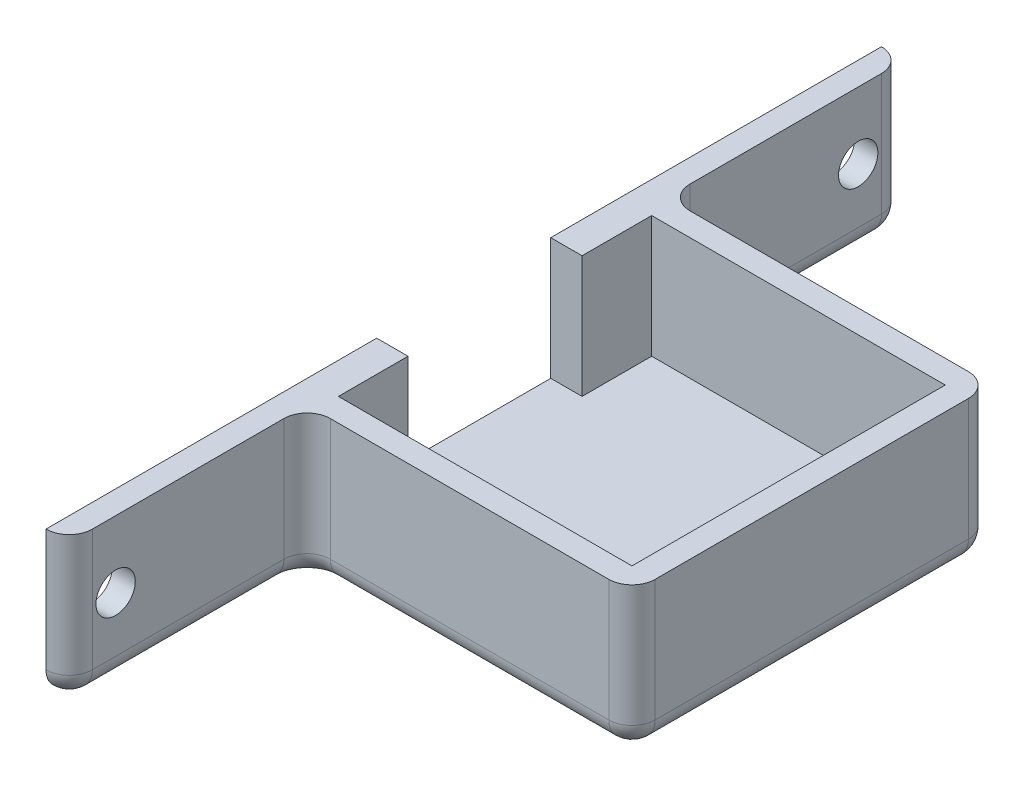
ISO-10303-21;
HEADER;
FILE_DESCRIPTION(('STEP AP214'),'2;1');
FILE_NAME('part.step','',(''),(''),'','','');
FILE_SCHEMA(('AUTOMOTIVE_DESIGN { 1 0 10303 214 1 1 1 1 }'));
ENDSEC;
DATA;
#1=APPLICATION_CONTEXT('core data for automotive mechanical design processes');
#2=APPLICATION_PROTOCOL_DEFINITION('international standard','automotive_design',2000,#1);
#3=PRODUCT_CONTEXT('',#1,'mechanical');
#4=PRODUCT('Part','Part','',(#3));
#5=PRODUCT_RELATED_PRODUCT_CATEGORY('part','',(#4));
#6=PRODUCT_DEFINITION_FORMATION('','',#4);
#7=PRODUCT_DEFINITION_CONTEXT('part definition',#1,'design');
#8=PRODUCT_DEFINITION('design','',#6,#7);
#9=PRODUCT_DEFINITION_SHAPE('','',#8);
#10=(LENGTH_UNIT() NAMED_UNIT(*) SI_UNIT(.MILLI.,.METRE.));
#11=(NAMED_UNIT(*) PLANE_ANGLE_UNIT() SI_UNIT($,.RADIAN.));
#12=(NAMED_UNIT(*) SI_UNIT($,.STERADIAN.) SOLID_ANGLE_UNIT());
#13=UNCERTAINTY_MEASURE_WITH_UNIT(LENGTH_MEASURE(1.E-05),#10,'distance_accuracy_value','');
#14=(GEOMETRIC_REPRESENTATION_CONTEXT(3) GLOBAL_UNCERTAINTY_ASSIGNED_CONTEXT((#13)) GLOBAL_UNIT_ASSIGNED_CONTEXT((#10,
#11,#12)) REPRESENTATION_CONTEXT('',''));
#15=CARTESIAN_POINT('',(0.,0.,0.));
#16=DIRECTION('',(0.,0.,1.));
#17=DIRECTION('',(1.,0.,0.));
#18=AXIS2_PLACEMENT_3D('',#15,#16,#17);
#19=CARTESIAN_POINT('',(0.,2.54,0.));
#20=DIRECTION('',(0.,-1.,0.));
#21=DIRECTION('',(0.,0.,-1.));
#22=AXIS2_PLACEMENT_3D('',#19,#20,#21);
#23=PLANE('',#22);
#24=DIRECTION('',(-1.,0.,0.));
#25=VECTOR('',#24,1.);
#26=CARTESIAN_POINT('',(0.,2.54,-7.62));
#27=LINE('',#26,#25);
#28=CARTESIAN_POINT('',(3.429,2.54,-7.62));
#29=VERTEX_POINT('',#28);
#30=CARTESIAN_POINT('',(0.,2.54,-7.62));
#31=VERTEX_POINT('',#30);
#32=EDGE_CURVE('E412',#29,#31,#27,.T.);
#33=ORIENTED_EDGE('',*,*,#32,.F.);
#34=DIRECTION('',(0.,0.,-1.));
#35=VECTOR('',#34,1.);
#36=CARTESIAN_POINT('',(3.429,2.54,0.));
#37=LINE('',#36,#35);
#38=CARTESIAN_POINT('',(3.429,2.54,0.));
#39=VERTEX_POINT('',#38);
#40=EDGE_CURVE('E410',#39,#29,#37,.T.);
#41=ORIENTED_EDGE('',*,*,#40,.F.);
#42=DIRECTION('',(1.,0.,0.));
#43=VECTOR('',#42,1.);
#44=CARTESIAN_POINT('',(0.,2.54,0.));
#45=LINE('',#44,#43);
#46=CARTESIAN_POINT('',(35.56,2.54,0.));
#47=VERTEX_POINT('',#46);
#48=EDGE_CURVE('E223',#39,#47,#45,.T.);
#49=ORIENTED_EDGE('',*,*,#48,.T.);
#50=DIRECTION('',(0.,0.,-1.));
#51=VECTOR('',#50,1.);
#52=CARTESIAN_POINT('',(35.56,2.54,0.));
#53=LINE('',#52,#51);
#54=CARTESIAN_POINT('',(35.56,2.54,-34.29));
#55=VERTEX_POINT('',#54);
#56=EDGE_CURVE('E259',#47,#55,#53,.T.);
#57=ORIENTED_EDGE('',*,*,#56,.T.);
#58=DIRECTION('',(-1.,0.,0.));
#59=VECTOR('',#58,1.);
#60=CARTESIAN_POINT('',(0.,2.54,-34.29));
#61=LINE('',#60,#59);
#62=CARTESIAN_POINT('',(3.429,2.54,-34.29));
#63=VERTEX_POINT('',#62);
#64=EDGE_CURVE('E261',#55,#63,#61,.T.);
#65=ORIENTED_EDGE('',*,*,#64,.T.);
#66=DIRECTION('',(0.,0.,-1.));
#67=VECTOR('',#66,1.);
#68=CARTESIAN_POINT('',(3.429,2.54,-34.29));
#69=LINE('',#68,#67);
#70=CARTESIAN_POINT('',(3.429,2.54,-26.67));
#71=VERTEX_POINT('',#70);
#72=EDGE_CURVE('E409',#71,#63,#69,.T.);
#73=ORIENTED_EDGE('',*,*,#72,.F.);
#74=DIRECTION('',(1.,0.,0.));
#75=VECTOR('',#74,1.);
#76=CARTESIAN_POINT('',(0.,2.54,-26.67));
#77=LINE('',#76,#75);
#78=CARTESIAN_POINT('',(0.,2.54,-26.67));
#79=VERTEX_POINT('',#78);
#80=EDGE_CURVE('E413',#79,#71,#77,.T.);
#81=ORIENTED_EDGE('',*,*,#80,.F.);
#82=DIRECTION('',(0.,0.,1.));
#83=VECTOR('',#82,1.);
#84=CARTESIAN_POINT('',(0.,2.54,0.));
#85=LINE('',#84,#83);
#86=EDGE_CURVE('E254',#79,#31,#85,.T.);
#87=ORIENTED_EDGE('',*,*,#86,.T.);
#88=EDGE_LOOP('',(#33,#41,#49,#57,#65,#73,#81,#87));
#89=FACE_BOUND('',#88,.T.);
#90=ADVANCED_FACE('F41',(#89),#23,.F.);
#91=CARTESIAN_POINT('',(35.56,15.875,0.));
#92=DIRECTION('',(0.,0.,1.));
#93=DIRECTION('',(1.,0.,0.));
#94=AXIS2_PLACEMENT_3D('',#91,#92,#93);
#95=PLANE('',#94);
#96=DIRECTION('',(0.,-1.,0.));
#97=VECTOR('',#96,1.);
#98=CARTESIAN_POINT('',(3.429,24.2309823479948,0.));
#99=LINE('',#98,#97);
#100=CARTESIAN_POINT('',(3.429,15.875,0.));
#101=VERTEX_POINT('',#100);
#102=EDGE_CURVE('E208',#101,#39,#99,.T.);
#103=ORIENTED_EDGE('',*,*,#102,.F.);
#104=DIRECTION('',(-1.,0.,0.));
#105=VECTOR('',#104,1.);
#106=CARTESIAN_POINT('',(35.56,15.875,0.));
#107=LINE('',#106,#105);
#108=CARTESIAN_POINT('',(35.56,15.875,0.));
#109=VERTEX_POINT('',#108);
#110=EDGE_CURVE('E222',#109,#101,#107,.T.);
#111=ORIENTED_EDGE('',*,*,#110,.F.);
#112=DIRECTION('',(0.,-1.,0.));
#113=VECTOR('',#112,1.);
#114=CARTESIAN_POINT('',(35.56,15.875,0.));
#115=LINE('',#114,#113);
#116=EDGE_CURVE('E248',#109,#47,#115,.T.);
#117=ORIENTED_EDGE('',*,*,#116,.T.);
#118=ORIENTED_EDGE('',*,*,#48,.F.);
#119=EDGE_LOOP('',(#103,#111,#117,#118));
#120=FACE_BOUND('',#119,.T.);
#121=ADVANCED_FACE('F220',(#120),#95,.F.);
#122=CARTESIAN_POINT('',(0.,15.875,-34.29));
#123=DIRECTION('',(0.,0.,-1.));
#124=DIRECTION('',(-1.,0.,0.));
#125=AXIS2_PLACEMENT_3D('',#122,#123,#124);
#126=PLANE('',#125);
#127=DIRECTION('',(0.,-1.,0.));
#128=VECTOR('',#127,1.);
#129=CARTESIAN_POINT('',(3.429,24.2309823479948,-34.29));
#130=LINE('',#129,#128);
#131=CARTESIAN_POINT('',(3.429,15.875,-34.29));
#132=VERTEX_POINT('',#131);
#133=EDGE_CURVE('E58',#132,#63,#130,.T.);
#134=ORIENTED_EDGE('',*,*,#133,.T.);
#135=ORIENTED_EDGE('',*,*,#64,.F.);
#136=DIRECTION('',(0.,-1.,0.));
#137=VECTOR('',#136,1.);
#138=CARTESIAN_POINT('',(35.56,15.875,-34.29));
#139=LINE('',#138,#137);
#140=CARTESIAN_POINT('',(35.56,15.875,-34.29));
#141=VERTEX_POINT('',#140);
#142=EDGE_CURVE('E250',#141,#55,#139,.T.);
#143=ORIENTED_EDGE('',*,*,#142,.F.);
#144=DIRECTION('',(1.,0.,0.));
#145=VECTOR('',#144,1.);
#146=CARTESIAN_POINT('',(0.,15.875,-34.29));
#147=LINE('',#146,#145);
#148=EDGE_CURVE('E234',#132,#141,#147,.T.);
#149=ORIENTED_EDGE('',*,*,#148,.F.);
#150=EDGE_LOOP('',(#134,#135,#143,#149));
#151=FACE_BOUND('',#150,.T.);
#152=ADVANCED_FACE('F404',(#151),#126,.F.);
#153=CARTESIAN_POINT('',(0.,0.,0.));
#154=DIRECTION('',(0.,-1.,0.));
#155=DIRECTION('',(0.,0.,-1.));
#156=AXIS2_PLACEMENT_3D('',#153,#154,#155);
#157=PLANE('',#156);
#158=CARTESIAN_POINT('',(5.08,0.,5.08));
#159=DIRECTION('',(0.,-1.,0.));
#160=DIRECTION('',(0.,0.,-1.));
#161=AXIS2_PLACEMENT_3D('',#158,#159,#160);
#162=CIRCLE('',#161,5.08);
#163=CARTESIAN_POINT('',(0.,0.,5.08));
#164=VERTEX_POINT('',#163);
#165=CARTESIAN_POINT('',(5.08,0.,0.));
#166=VERTEX_POINT('',#165);
#167=EDGE_CURVE('E300',#164,#166,#162,.T.);
#168=ORIENTED_EDGE('',*,*,#167,.F.);
#169=DIRECTION('',(0.,0.,1.));
#170=VECTOR('',#169,1.);
#171=CARTESIAN_POINT('',(0.,0.,0.));
#172=LINE('',#171,#170);
#173=CARTESIAN_POINT('',(0.,0.,-39.37));
#174=VERTEX_POINT('',#173);
#175=EDGE_CURVE('E266',#174,#164,#172,.T.);
#176=ORIENTED_EDGE('',*,*,#175,.F.);
#177=CARTESIAN_POINT('',(5.08,0.,-39.37));
#178=DIRECTION('',(0.,-1.,0.));
#179=DIRECTION('',(0.,0.,-1.));
#180=AXIS2_PLACEMENT_3D('',#177,#178,#179);
#181=CIRCLE('',#180,5.08);
#182=CARTESIAN_POINT('',(5.08,0.,-34.29));
#183=VERTEX_POINT('',#182);
#184=EDGE_CURVE('E297',#183,#174,#181,.T.);
#185=ORIENTED_EDGE('',*,*,#184,.F.);
#186=DIRECTION('',(-1.,0.,0.));
#187=VECTOR('',#186,1.);
#188=CARTESIAN_POINT('',(38.1,0.,-34.29));
#189=LINE('',#188,#187);
#190=CARTESIAN_POINT('',(35.56,0.,-34.29));
#191=VERTEX_POINT('',#190);
#192=EDGE_CURVE('E295',#183,#191,#189,.F.);
#193=ORIENTED_EDGE('',*,*,#192,.T.);
#194=DIRECTION('',(0.,0.,-1.));
#195=VECTOR('',#194,1.);
#196=CARTESIAN_POINT('',(35.56,0.,2.54));
#197=LINE('',#196,#195);
#198=CARTESIAN_POINT('',(35.56,0.,0.));
#199=VERTEX_POINT('',#198);
#200=EDGE_CURVE('E291',#191,#199,#197,.F.);
#201=ORIENTED_EDGE('',*,*,#200,.T.);
#202=DIRECTION('',(1.,0.,0.));
#203=VECTOR('',#202,1.);
#204=CARTESIAN_POINT('',(2.54000000000001,0.,0.));
#205=LINE('',#204,#203);
#206=EDGE_CURVE('E293',#199,#166,#205,.F.);
#207=ORIENTED_EDGE('',*,*,#206,.T.);
#208=EDGE_LOOP('',(#168,#176,#185,#193,#201,#207));
#209=FACE_BOUND('',#208,.T.);
#210=ADVANCED_FACE('F460',(#209),#157,.T.);
#211=CARTESIAN_POINT('',(0.,15.875,-36.83));
#212=DIRECTION('',(0.,0.,1.));
#213=DIRECTION('',(1.,0.,0.));
#214=AXIS2_PLACEMENT_3D('',#211,#212,#213);
#215=PLANE('',#214);
#216=DIRECTION('',(-1.,0.,0.));
#217=VECTOR('',#216,1.);
#218=CARTESIAN_POINT('',(2.54,2.54,-36.83));
#219=LINE('',#218,#217);
#220=CARTESIAN_POINT('',(35.56,2.54,-36.83));
#221=VERTEX_POINT('',#220);
#222=CARTESIAN_POINT('',(5.08,2.54,-36.83));
#223=VERTEX_POINT('',#222);
#224=EDGE_CURVE('E277',#221,#223,#219,.T.);
#225=ORIENTED_EDGE('',*,*,#224,.T.);
#226=DIRECTION('',(0.,-1.,0.));
#227=VECTOR('',#226,1.);
#228=CARTESIAN_POINT('',(5.08,15.875,-36.83));
#229=LINE('',#228,#227);
#230=CARTESIAN_POINT('',(5.08,15.875,-36.83));
#231=VERTEX_POINT('',#230);
#232=EDGE_CURVE('E281',#223,#231,#229,.F.);
#233=ORIENTED_EDGE('',*,*,#232,.T.);
#234=DIRECTION('',(-1.,0.,0.));
#235=VECTOR('',#234,1.);
#236=CARTESIAN_POINT('',(0.,15.875,-36.83));
#237=LINE('',#236,#235);
#238=CARTESIAN_POINT('',(35.56,15.875,-36.83));
#239=VERTEX_POINT('',#238);
#240=EDGE_CURVE('E243',#239,#231,#237,.T.);
#241=ORIENTED_EDGE('',*,*,#240,.F.);
#242=DIRECTION('',(0.,-1.,0.));
#243=VECTOR('',#242,1.);
#244=CARTESIAN_POINT('',(35.56,15.875,-36.83));
#245=LINE('',#244,#243);
#246=EDGE_CURVE('E279',#239,#221,#245,.T.);
#247=ORIENTED_EDGE('',*,*,#246,.T.);
#248=EDGE_LOOP('',(#225,#233,#241,#247));
#249=FACE_BOUND('',#248,.T.);
#250=ADVANCED_FACE('F463',(#249),#215,.F.);
#251=CARTESIAN_POINT('',(38.1,15.875,2.54));
#252=DIRECTION('',(0.,0.,-1.));
#253=DIRECTION('',(-1.,0.,0.));
#254=AXIS2_PLACEMENT_3D('',#251,#252,#253);
#255=PLANE('',#254);
#256=DIRECTION('',(1.,0.,0.));
#257=VECTOR('',#256,1.);
#258=CARTESIAN_POINT('',(38.1,15.875,2.54));
#259=LINE('',#258,#257);
#260=CARTESIAN_POINT('',(5.08000000000002,15.875,2.54));
#261=VERTEX_POINT('',#260);
#262=CARTESIAN_POINT('',(35.56,15.875,2.54));
#263=VERTEX_POINT('',#262);
#264=EDGE_CURVE('E232',#261,#263,#259,.T.);
#265=ORIENTED_EDGE('',*,*,#264,.F.);
#266=DIRECTION('',(0.,1.,0.));
#267=VECTOR('',#266,1.);
#268=CARTESIAN_POINT('',(5.08,0.,2.54));
#269=LINE('',#268,#267);
#270=CARTESIAN_POINT('',(5.08,2.54,2.54));
#271=VERTEX_POINT('',#270);
#272=EDGE_CURVE('E66',#261,#271,#269,.F.);
#273=ORIENTED_EDGE('',*,*,#272,.T.);
#274=DIRECTION('',(1.,0.,0.));
#275=VECTOR('',#274,1.);
#276=CARTESIAN_POINT('',(38.1,2.54,2.54));
#277=LINE('',#276,#275);
#278=CARTESIAN_POINT('',(35.56,2.54,2.54));
#279=VERTEX_POINT('',#278);
#280=EDGE_CURVE('E317',#271,#279,#277,.T.);
#281=ORIENTED_EDGE('',*,*,#280,.T.);
#282=DIRECTION('',(0.,-1.,0.));
#283=VECTOR('',#282,1.);
#284=CARTESIAN_POINT('',(35.56,15.875,2.54));
#285=LINE('',#284,#283);
#286=EDGE_CURVE('E315',#279,#263,#285,.F.);
#287=ORIENTED_EDGE('',*,*,#286,.T.);
#288=EDGE_LOOP('',(#265,#273,#281,#287));
#289=FACE_BOUND('',#288,.T.);
#290=ADVANCED_FACE('F468',(#289),#255,.F.);
#291=CARTESIAN_POINT('',(0.,2.54,0.));
#292=DIRECTION('',(1.,0.,0.));
#293=DIRECTION('',(0.,0.,-1.));
#294=AXIS2_PLACEMENT_3D('',#291,#292,#293);
#295=PLANE('',#294);
#296=ORIENTED_EDGE('',*,*,#86,.F.);
#297=DIRECTION('',(0.,-1.,0.));
#298=VECTOR('',#297,1.);
#299=CARTESIAN_POINT('',(0.,24.2309823479948,-26.67));
#300=LINE('',#299,#298);
#301=CARTESIAN_POINT('',(0.,15.875,-26.67));
#302=VERTEX_POINT('',#301);
#303=EDGE_CURVE('E422',#302,#79,#300,.T.);
#304=ORIENTED_EDGE('',*,*,#303,.F.);
#305=DIRECTION('',(0.,0.,1.));
#306=VECTOR('',#305,1.);
#307=CARTESIAN_POINT('',(0.,15.875,-34.29));
#308=LINE('',#307,#306);
#309=CARTESIAN_POINT('',(0.,15.875,-62.865));
#310=VERTEX_POINT('',#309);
#311=EDGE_CURVE('E246',#310,#302,#308,.T.);
#312=ORIENTED_EDGE('',*,*,#311,.F.);
#313=DIRECTION('',(0.,1.,0.));
#314=VECTOR('',#313,1.);
#315=CARTESIAN_POINT('',(0.,15.875,-62.865));
#316=LINE('',#315,#314);
#317=CARTESIAN_POINT('',(0.,2.54,-62.865));
#318=VERTEX_POINT('',#317);
#319=EDGE_CURVE('E385',#318,#310,#316,.T.);
#320=ORIENTED_EDGE('',*,*,#319,.F.);
#321=CARTESIAN_POINT('',(0.,2.54,-60.325));
#322=DIRECTION('',(1.,0.,0.));
#323=DIRECTION('',(0.,0.,-1.));
#324=AXIS2_PLACEMENT_3D('',#321,#322,#323);
#325=CIRCLE('',#324,2.54);
#326=CARTESIAN_POINT('',(0.,0.,-60.325));
#327=VERTEX_POINT('',#326);
#328=EDGE_CURVE('E264',#318,#327,#325,.F.);
#329=ORIENTED_EDGE('',*,*,#328,.T.);
#330=EDGE_CURVE('E257',#327,#174,#172,.T.);
#331=ORIENTED_EDGE('',*,*,#330,.T.);
#332=ORIENTED_EDGE('',*,*,#175,.T.);
#333=CARTESIAN_POINT('',(0.,0.,26.035));
#334=VERTEX_POINT('',#333);
#335=EDGE_CURVE('E253',#164,#334,#172,.T.);
#336=ORIENTED_EDGE('',*,*,#335,.T.);
#337=CARTESIAN_POINT('',(0.,2.54,26.035));
#338=DIRECTION('',(1.,0.,0.));
#339=DIRECTION('',(0.,0.,-1.));
#340=AXIS2_PLACEMENT_3D('',#337,#338,#339);
#341=CIRCLE('',#340,2.54);
#342=CARTESIAN_POINT('',(0.,2.54,28.575));
#343=VERTEX_POINT('',#342);
#344=EDGE_CURVE('E268',#334,#343,#341,.F.);
#345=ORIENTED_EDGE('',*,*,#344,.T.);
#346=DIRECTION('',(0.,-1.,0.));
#347=VECTOR('',#346,1.);
#348=CARTESIAN_POINT('',(0.,15.875,28.575));
#349=LINE('',#348,#347);
#350=CARTESIAN_POINT('',(0.,15.875,28.575));
#351=VERTEX_POINT('',#350);
#352=EDGE_CURVE('E391',#351,#343,#349,.T.);
#353=ORIENTED_EDGE('',*,*,#352,.F.);
#354=DIRECTION('',(0.,0.,1.));
#355=VECTOR('',#354,1.);
#356=CARTESIAN_POINT('',(0.,15.875,2.54));
#357=LINE('',#356,#355);
#358=CARTESIAN_POINT('',(0.,15.875,-7.62));
#359=VERTEX_POINT('',#358);
#360=EDGE_CURVE('E230',#359,#351,#357,.T.);
#361=ORIENTED_EDGE('',*,*,#360,.F.);
#362=DIRECTION('',(0.,-1.,0.));
#363=VECTOR('',#362,1.);
#364=CARTESIAN_POINT('',(0.,24.2309823479948,-7.62));
#365=LINE('',#364,#363);
#366=EDGE_CURVE('E417',#359,#31,#365,.T.);
#367=ORIENTED_EDGE('',*,*,#366,.T.);
#368=EDGE_LOOP('',(#296,#304,#312,#320,#329,#331,#332,#336,#345,#353,#361,#367));
#369=FACE_BOUND('',#368,.T.);
#370=CARTESIAN_POINT('',(0.,8.5725,-57.785));
#371=DIRECTION('',(-1.,0.,0.));
#372=DIRECTION('',(0.,0.,1.));
#373=AXIS2_PLACEMENT_3D('',#370,#371,#372);
#374=CIRCLE('',#373,2.15265);
#375=CARTESIAN_POINT('',(0.,8.5725,-55.63235));
#376=VERTEX_POINT('',#375);
#377=EDGE_CURVE('E379',#376,#376,#374,.T.);
#378=ORIENTED_EDGE('',*,*,#377,.F.);
#379=EDGE_LOOP('',(#378));
#380=FACE_BOUND('',#379,.T.);
#381=CARTESIAN_POINT('',(0.,8.5725,23.495));
#382=DIRECTION('',(-1.,0.,0.));
#383=DIRECTION('',(0.,0.,-1.));
#384=AXIS2_PLACEMENT_3D('',#381,#382,#383);
#385=CIRCLE('',#384,2.15265);
#386=CARTESIAN_POINT('',(0.,8.5725,21.34235));
#387=VERTEX_POINT('',#386);
#388=EDGE_CURVE('E374',#387,#387,#385,.T.);
#389=ORIENTED_EDGE('',*,*,#388,.F.);
#390=EDGE_LOOP('',(#389));
#391=FACE_BOUND('',#390,.T.);
#392=ADVANCED_FACE('F465',(#369,#380,#391),#295,.F.);
#393=CARTESIAN_POINT('',(35.56,15.875,-34.29));
#394=DIRECTION('',(1.,0.,0.));
#395=DIRECTION('',(0.,0.,-1.));
#396=AXIS2_PLACEMENT_3D('',#393,#394,#395);
#397=PLANE('',#396);
#398=ORIENTED_EDGE('',*,*,#142,.T.);
#399=ORIENTED_EDGE('',*,*,#56,.F.);
#400=ORIENTED_EDGE('',*,*,#116,.F.);
#401=DIRECTION('',(0.,0.,1.));
#402=VECTOR('',#401,1.);
#403=CARTESIAN_POINT('',(35.56,15.875,-34.29));
#404=LINE('',#403,#402);
#405=EDGE_CURVE('E228',#141,#109,#404,.T.);
#406=ORIENTED_EDGE('',*,*,#405,.F.);
#407=EDGE_LOOP('',(#398,#399,#400,#406));
#408=FACE_BOUND('',#407,.T.);
#409=ADVANCED_FACE('F401',(#408),#397,.F.);
#410=CARTESIAN_POINT('',(38.1,15.875,-36.83));
#411=DIRECTION('',(-1.,0.,0.));
#412=DIRECTION('',(0.,0.,1.));
#413=AXIS2_PLACEMENT_3D('',#410,#411,#412);
#414=PLANE('',#413);
#415=DIRECTION('',(0.,0.,-1.));
#416=VECTOR('',#415,1.);
#417=CARTESIAN_POINT('',(38.1,2.54,-36.83));
#418=LINE('',#417,#416);
#419=CARTESIAN_POINT('',(38.1,2.54,0.));
#420=VERTEX_POINT('',#419);
#421=CARTESIAN_POINT('',(38.1,2.54,-34.29));
#422=VERTEX_POINT('',#421);
#423=EDGE_CURVE('E303',#420,#422,#418,.T.);
#424=ORIENTED_EDGE('',*,*,#423,.T.);
#425=DIRECTION('',(0.,-1.,0.));
#426=VECTOR('',#425,1.);
#427=CARTESIAN_POINT('',(38.1,15.875,-34.29));
#428=LINE('',#427,#426);
#429=CARTESIAN_POINT('',(38.1,15.875,-34.29));
#430=VERTEX_POINT('',#429);
#431=EDGE_CURVE('E307',#422,#430,#428,.F.);
#432=ORIENTED_EDGE('',*,*,#431,.T.);
#433=DIRECTION('',(0.,0.,-1.));
#434=VECTOR('',#433,1.);
#435=CARTESIAN_POINT('',(38.1,15.875,-36.83));
#436=LINE('',#435,#434);
#437=CARTESIAN_POINT('',(38.1,15.875,0.));
#438=VERTEX_POINT('',#437);
#439=EDGE_CURVE('E240',#438,#430,#436,.T.);
#440=ORIENTED_EDGE('',*,*,#439,.F.);
#441=DIRECTION('',(0.,-1.,0.));
#442=VECTOR('',#441,1.);
#443=CARTESIAN_POINT('',(38.1,15.875,0.));
#444=LINE('',#443,#442);
#445=EDGE_CURVE('E305',#438,#420,#444,.T.);
#446=ORIENTED_EDGE('',*,*,#445,.T.);
#447=EDGE_LOOP('',(#424,#432,#440,#446));
#448=FACE_BOUND('',#447,.T.);
#449=ADVANCED_FACE('F579',(#448),#414,.F.);
#450=CARTESIAN_POINT('',(0.,15.875,0.));
#451=DIRECTION('',(0.,-1.,0.));
#452=DIRECTION('',(0.,0.,-1.));
#453=AXIS2_PLACEMENT_3D('',#450,#451,#452);
#454=PLANE('',#453);
#455=DIRECTION('',(0.,0.,1.));
#456=VECTOR('',#455,1.);
#457=CARTESIAN_POINT('',(2.54,15.875,-62.865));
#458=LINE('',#457,#456);
#459=CARTESIAN_POINT('',(2.54,15.875,-60.325));
#460=VERTEX_POINT('',#459);
#461=CARTESIAN_POINT('',(2.54,15.875,-39.37));
#462=VERTEX_POINT('',#461);
#463=EDGE_CURVE('E388',#460,#462,#458,.T.);
#464=ORIENTED_EDGE('',*,*,#463,.F.);
#465=CARTESIAN_POINT('',(0.,15.875,-60.325));
#466=DIRECTION('',(0.,-1.,0.));
#467=DIRECTION('',(0.,0.,-1.));
#468=AXIS2_PLACEMENT_3D('',#465,#466,#467);
#469=CIRCLE('',#468,2.54);
#470=EDGE_CURVE('E289',#460,#310,#469,.F.);
#471=ORIENTED_EDGE('',*,*,#470,.T.);
#472=ORIENTED_EDGE('',*,*,#311,.T.);
#473=DIRECTION('',(-1.,0.,0.));
#474=VECTOR('',#473,1.);
#475=CARTESIAN_POINT('',(0.,15.875,-26.67));
#476=LINE('',#475,#474);
#477=CARTESIAN_POINT('',(3.429,15.875,-26.67));
#478=VERTEX_POINT('',#477);
#479=EDGE_CURVE('E325',#478,#302,#476,.T.);
#480=ORIENTED_EDGE('',*,*,#479,.F.);
#481=DIRECTION('',(0.,0.,1.));
#482=VECTOR('',#481,1.);
#483=CARTESIAN_POINT('',(3.429,15.875,-34.29));
#484=LINE('',#483,#482);
#485=EDGE_CURVE('E397',#132,#478,#484,.T.);
#486=ORIENTED_EDGE('',*,*,#485,.F.);
#487=ORIENTED_EDGE('',*,*,#148,.T.);
#488=ORIENTED_EDGE('',*,*,#405,.T.);
#489=ORIENTED_EDGE('',*,*,#110,.T.);
#490=DIRECTION('',(0.,0.,1.));
#491=VECTOR('',#490,1.);
#492=CARTESIAN_POINT('',(3.429,15.875,0.));
#493=LINE('',#492,#491);
#494=CARTESIAN_POINT('',(3.429,15.875,-7.62));
#495=VERTEX_POINT('',#494);
#496=EDGE_CURVE('E204',#495,#101,#493,.T.);
#497=ORIENTED_EDGE('',*,*,#496,.F.);
#498=DIRECTION('',(1.,0.,0.));
#499=VECTOR('',#498,1.);
#500=CARTESIAN_POINT('',(0.,15.875,-7.62));
#501=LINE('',#500,#499);
#502=EDGE_CURVE('E215',#359,#495,#501,.T.);
#503=ORIENTED_EDGE('',*,*,#502,.F.);
#504=ORIENTED_EDGE('',*,*,#360,.T.);
#505=CARTESIAN_POINT('',(0.,15.875,26.035));
#506=DIRECTION('',(0.,-1.,0.));
#507=DIRECTION('',(0.,0.,-1.));
#508=AXIS2_PLACEMENT_3D('',#505,#506,#507);
#509=CIRCLE('',#508,2.54);
#510=CARTESIAN_POINT('',(2.54,15.875,26.035));
#511=VERTEX_POINT('',#510);
#512=EDGE_CURVE('E285',#351,#511,#509,.F.);
#513=ORIENTED_EDGE('',*,*,#512,.T.);
#514=DIRECTION('',(0.,0.,-1.));
#515=VECTOR('',#514,1.);
#516=CARTESIAN_POINT('',(2.54,15.875,28.575));
#517=LINE('',#516,#515);
#518=CARTESIAN_POINT('',(2.54,15.875,5.08));
#519=VERTEX_POINT('',#518);
#520=EDGE_CURVE('E394',#511,#519,#517,.T.);
#521=ORIENTED_EDGE('',*,*,#520,.T.);
#522=CARTESIAN_POINT('',(5.08,15.875,5.08));
#523=DIRECTION('',(0.,-1.,0.));
#524=DIRECTION('',(0.,0.,-1.));
#525=AXIS2_PLACEMENT_3D('',#522,#523,#524);
#526=CIRCLE('',#525,2.54);
#527=EDGE_CURVE('E11',#519,#261,#526,.T.);
#528=ORIENTED_EDGE('',*,*,#527,.T.);
#529=ORIENTED_EDGE('',*,*,#264,.T.);
#530=CARTESIAN_POINT('',(35.56,15.875,0.));
#531=DIRECTION('',(0.,-1.,0.));
#532=DIRECTION('',(0.,0.,-1.));
#533=AXIS2_PLACEMENT_3D('',#530,#531,#532);
#534=CIRCLE('',#533,2.54);
#535=EDGE_CURVE('E283',#263,#438,#534,.F.);
#536=ORIENTED_EDGE('',*,*,#535,.T.);
#537=ORIENTED_EDGE('',*,*,#439,.T.);
#538=CARTESIAN_POINT('',(35.56,15.875,-34.29));
#539=DIRECTION('',(0.,-1.,0.));
#540=DIRECTION('',(0.,0.,-1.));
#541=AXIS2_PLACEMENT_3D('',#538,#539,#540);
#542=CIRCLE('',#541,2.54);
#543=EDGE_CURVE('E287',#430,#239,#542,.F.);
#544=ORIENTED_EDGE('',*,*,#543,.T.);
#545=ORIENTED_EDGE('',*,*,#240,.T.);
#546=CARTESIAN_POINT('',(5.08,15.875,-39.37));
#547=DIRECTION('',(0.,-1.,0.));
#548=DIRECTION('',(0.,0.,-1.));
#549=AXIS2_PLACEMENT_3D('',#546,#547,#548);
#550=CIRCLE('',#549,2.54);
#551=EDGE_CURVE('E50',#231,#462,#550,.T.);
#552=ORIENTED_EDGE('',*,*,#551,.T.);
#553=EDGE_LOOP('',(#464,#471,#472,#480,#486,#487,#488,#489,#497,#503,#504,#513,#521,#528,#529,
#536,#537,#544,#545,#552));
#554=FACE_BOUND('',#553,.T.);
#555=ADVANCED_FACE('F226',(#554),#454,.F.);
#556=CARTESIAN_POINT('',(2.54,15.875,28.575));
#557=DIRECTION('',(-1.,0.,0.));
#558=DIRECTION('',(0.,-1.,0.));
#559=AXIS2_PLACEMENT_3D('',#556,#557,#558);
#560=PLANE('',#559);
#561=CARTESIAN_POINT('',(2.54,8.5725,23.495));
#562=DIRECTION('',(-1.,0.,0.));
#563=DIRECTION('',(0.,-1.,0.));
#564=AXIS2_PLACEMENT_3D('',#561,#562,#563);
#565=CIRCLE('',#564,2.15265);
#566=CARTESIAN_POINT('',(2.54,6.41985,23.495));
#567=VERTEX_POINT('',#566);
#568=EDGE_CURVE('E369',#567,#567,#565,.F.);
#569=ORIENTED_EDGE('',*,*,#568,.F.);
#570=EDGE_LOOP('',(#569));
#571=FACE_BOUND('',#570,.T.);
#572=DIRECTION('',(0.,0.,-1.));
#573=VECTOR('',#572,1.);
#574=CARTESIAN_POINT('',(2.54,2.54,2.54));
#575=LINE('',#574,#573);
#576=CARTESIAN_POINT('',(2.54,2.54,26.035));
#577=VERTEX_POINT('',#576);
#578=CARTESIAN_POINT('',(2.54,2.54,5.08));
#579=VERTEX_POINT('',#578);
#580=EDGE_CURVE('E309',#577,#579,#575,.T.);
#581=ORIENTED_EDGE('',*,*,#580,.T.);
#582=DIRECTION('',(0.,1.,0.));
#583=VECTOR('',#582,1.);
#584=CARTESIAN_POINT('',(2.54,15.875,5.08));
#585=LINE('',#584,#583);
#586=EDGE_CURVE('E313',#579,#519,#585,.T.);
#587=ORIENTED_EDGE('',*,*,#586,.T.);
#588=ORIENTED_EDGE('',*,*,#520,.F.);
#589=DIRECTION('',(0.,1.,0.));
#590=VECTOR('',#589,1.);
#591=CARTESIAN_POINT('',(2.54,0.,26.035));
#592=LINE('',#591,#590);
#593=EDGE_CURVE('E311',#511,#577,#592,.F.);
#594=ORIENTED_EDGE('',*,*,#593,.T.);
#595=EDGE_LOOP('',(#581,#587,#588,#594));
#596=FACE_BOUND('',#595,.T.);
#597=ADVANCED_FACE('F439',(#571,#596),#560,.F.);
#598=CARTESIAN_POINT('',(2.54,15.875,-62.865));
#599=DIRECTION('',(-1.,0.,0.));
#600=DIRECTION('',(0.,-1.,0.));
#601=AXIS2_PLACEMENT_3D('',#598,#599,#600);
#602=PLANE('',#601);
#603=ORIENTED_EDGE('',*,*,#463,.T.);
#604=DIRECTION('',(0.,-1.,0.));
#605=VECTOR('',#604,1.);
#606=CARTESIAN_POINT('',(2.54,0.,-39.37));
#607=LINE('',#606,#605);
#608=CARTESIAN_POINT('',(2.54,2.54,-39.37));
#609=VERTEX_POINT('',#608);
#610=EDGE_CURVE('E275',#462,#609,#607,.T.);
#611=ORIENTED_EDGE('',*,*,#610,.T.);
#612=DIRECTION('',(0.,0.,1.));
#613=VECTOR('',#612,1.);
#614=CARTESIAN_POINT('',(2.54,2.54,-62.865));
#615=LINE('',#614,#613);
#616=CARTESIAN_POINT('',(2.54,2.54,-60.325));
#617=VERTEX_POINT('',#616);
#618=EDGE_CURVE('E271',#609,#617,#615,.F.);
#619=ORIENTED_EDGE('',*,*,#618,.T.);
#620=DIRECTION('',(0.,-1.,0.));
#621=VECTOR('',#620,1.);
#622=CARTESIAN_POINT('',(2.54,15.875,-60.325));
#623=LINE('',#622,#621);
#624=EDGE_CURVE('E273',#617,#460,#623,.F.);
#625=ORIENTED_EDGE('',*,*,#624,.T.);
#626=EDGE_LOOP('',(#603,#611,#619,#625));
#627=FACE_BOUND('',#626,.T.);
#628=CARTESIAN_POINT('',(2.54,8.5725,-57.785));
#629=DIRECTION('',(-1.,0.,0.));
#630=DIRECTION('',(0.,-1.,0.));
#631=AXIS2_PLACEMENT_3D('',#628,#629,#630);
#632=CIRCLE('',#631,2.15265);
#633=CARTESIAN_POINT('',(2.54,6.41985,-57.785));
#634=VERTEX_POINT('',#633);
#635=EDGE_CURVE('E382',#634,#634,#632,.F.);
#636=ORIENTED_EDGE('',*,*,#635,.F.);
#637=EDGE_LOOP('',(#636));
#638=FACE_BOUND('',#637,.T.);
#639=ADVANCED_FACE('F437',(#627,#638),#602,.F.);
#640=CARTESIAN_POINT('',(38.101,8.5725,-57.785));
#641=DIRECTION('',(-1.,0.,0.));
#642=DIRECTION('',(0.,0.,1.));
#643=AXIS2_PLACEMENT_3D('',#640,#641,#642);
#644=CYLINDRICAL_SURFACE('',#643,2.15265);
#645=ORIENTED_EDGE('',*,*,#377,.T.);
#646=EDGE_LOOP('',(#645));
#647=FACE_BOUND('',#646,.T.);
#648=ORIENTED_EDGE('',*,*,#635,.T.);
#649=EDGE_LOOP('',(#648));
#650=FACE_BOUND('',#649,.T.);
#651=ADVANCED_FACE('F435',(#647,#650),#644,.F.);
#652=CARTESIAN_POINT('',(38.101,8.5725,23.495));
#653=DIRECTION('',(-1.,0.,0.));
#654=DIRECTION('',(0.,0.,1.));
#655=AXIS2_PLACEMENT_3D('',#652,#653,#654);
#656=CYLINDRICAL_SURFACE('',#655,2.15265);
#657=ORIENTED_EDGE('',*,*,#388,.T.);
#658=EDGE_LOOP('',(#657));
#659=FACE_BOUND('',#658,.T.);
#660=ORIENTED_EDGE('',*,*,#568,.T.);
#661=EDGE_LOOP('',(#660));
#662=FACE_BOUND('',#661,.T.);
#663=ADVANCED_FACE('F446',(#659,#662),#656,.F.);
#664=CARTESIAN_POINT('',(0.,0.,-60.325));
#665=DIRECTION('',(0.,-1.,0.));
#666=DIRECTION('',(1.,0.,0.));
#667=AXIS2_PLACEMENT_3D('',#664,#665,#666);
#668=CYLINDRICAL_SURFACE('',#667,2.54);
#669=ORIENTED_EDGE('',*,*,#470,.F.);
#670=ORIENTED_EDGE('',*,*,#624,.F.);
#671=CARTESIAN_POINT('',(0.,2.54,-60.325));
#672=DIRECTION('',(0.,-1.,0.));
#673=DIRECTION('',(0.,0.,-1.));
#674=AXIS2_PLACEMENT_3D('',#671,#672,#673);
#675=CIRCLE('',#674,2.54);
#676=EDGE_CURVE('E45',#318,#617,#675,.T.);
#677=ORIENTED_EDGE('',*,*,#676,.F.);
#678=ORIENTED_EDGE('',*,*,#319,.T.);
#679=EDGE_LOOP('',(#669,#670,#677,#678));
#680=FACE_BOUND('',#679,.T.);
#681=ADVANCED_FACE('F43',(#680),#668,.T.);
#682=CARTESIAN_POINT('',(0.,2.54,-60.325));
#683=DIRECTION('',(0.,0.,-1.));
#684=DIRECTION('',(-1.,0.,0.));
#685=AXIS2_PLACEMENT_3D('',#682,#683,#684);
#686=SPHERICAL_SURFACE('',#685,2.54);
#687=ORIENTED_EDGE('',*,*,#328,.F.);
#688=ORIENTED_EDGE('',*,*,#676,.T.);
#689=CARTESIAN_POINT('',(0.,2.54,-60.325));
#690=DIRECTION('',(0.,0.,-1.));
#691=DIRECTION('',(-1.,0.,0.));
#692=AXIS2_PLACEMENT_3D('',#689,#690,#691);
#693=CIRCLE('',#692,2.54);
#694=EDGE_CURVE('E362',#327,#617,#693,.F.);
#695=ORIENTED_EDGE('',*,*,#694,.F.);
#696=EDGE_LOOP('',(#687,#688,#695));
#697=FACE_BOUND('',#696,.T.);
#698=ADVANCED_FACE('F528',(#697),#686,.T.);
#699=CARTESIAN_POINT('',(5.08,15.875,-39.37));
#700=DIRECTION('',(0.,1.,0.));
#701=DIRECTION('',(-1.,0.,0.));
#702=AXIS2_PLACEMENT_3D('',#699,#700,#701);
#703=CYLINDRICAL_SURFACE('',#702,2.54);
#704=ORIENTED_EDGE('',*,*,#551,.F.);
#705=ORIENTED_EDGE('',*,*,#232,.F.);
#706=CARTESIAN_POINT('',(5.08,2.54,-39.37));
#707=DIRECTION('',(0.,-1.,0.));
#708=DIRECTION('',(0.,0.,-1.));
#709=AXIS2_PLACEMENT_3D('',#706,#707,#708);
#710=CIRCLE('',#709,2.54);
#711=EDGE_CURVE('E360',#609,#223,#710,.F.);
#712=ORIENTED_EDGE('',*,*,#711,.F.);
#713=ORIENTED_EDGE('',*,*,#610,.F.);
#714=EDGE_LOOP('',(#704,#705,#712,#713));
#715=FACE_BOUND('',#714,.T.);
#716=ADVANCED_FACE('F526',(#715),#703,.F.);
#717=CARTESIAN_POINT('',(0.,2.54,0.));
#718=DIRECTION('',(0.,0.,-1.));
#719=DIRECTION('',(-1.,0.,0.));
#720=AXIS2_PLACEMENT_3D('',#717,#718,#719);
#721=CYLINDRICAL_SURFACE('',#720,2.54);
#722=ORIENTED_EDGE('',*,*,#694,.T.);
#723=ORIENTED_EDGE('',*,*,#618,.F.);
#724=CARTESIAN_POINT('',(0.,2.54,-39.37));
#725=DIRECTION('',(0.,0.,1.));
#726=DIRECTION('',(1.,0.,0.));
#727=AXIS2_PLACEMENT_3D('',#724,#725,#726);
#728=CIRCLE('',#727,2.54);
#729=EDGE_CURVE('E357',#174,#609,#728,.T.);
#730=ORIENTED_EDGE('',*,*,#729,.F.);
#731=ORIENTED_EDGE('',*,*,#330,.F.);
#732=EDGE_LOOP('',(#722,#723,#730,#731));
#733=FACE_BOUND('',#732,.T.);
#734=ADVANCED_FACE('F522',(#733),#721,.T.);
#735=CARTESIAN_POINT('',(5.08,2.54,-39.37));
#736=DIRECTION('',(0.,-1.,0.));
#737=DIRECTION('',(0.,0.,-1.));
#738=AXIS2_PLACEMENT_3D('',#735,#736,#737);
#739=TOROIDAL_SURFACE('',#738,5.08,2.54);
#740=ORIENTED_EDGE('',*,*,#729,.T.);
#741=ORIENTED_EDGE('',*,*,#711,.T.);
#742=CARTESIAN_POINT('',(5.08,2.54,-34.29));
#743=DIRECTION('',(-1.,0.,0.));
#744=DIRECTION('',(0.,0.,1.));
#745=AXIS2_PLACEMENT_3D('',#742,#743,#744);
#746=CIRCLE('',#745,2.54);
#747=EDGE_CURVE('E354',#183,#223,#746,.F.);
#748=ORIENTED_EDGE('',*,*,#747,.F.);
#749=ORIENTED_EDGE('',*,*,#184,.T.);
#750=EDGE_LOOP('',(#740,#741,#748,#749));
#751=FACE_BOUND('',#750,.T.);
#752=ADVANCED_FACE('F518',(#751),#739,.T.);
#753=CARTESIAN_POINT('',(35.56,15.875,-34.29));
#754=DIRECTION('',(0.,-1.,0.));
#755=DIRECTION('',(0.,0.,-1.));
#756=AXIS2_PLACEMENT_3D('',#753,#754,#755);
#757=CYLINDRICAL_SURFACE('',#756,2.54);
#758=ORIENTED_EDGE('',*,*,#543,.F.);
#759=ORIENTED_EDGE('',*,*,#431,.F.);
#760=CARTESIAN_POINT('',(35.56,2.54,-34.29));
#761=DIRECTION('',(0.,-1.,0.));
#762=DIRECTION('',(0.,0.,-1.));
#763=AXIS2_PLACEMENT_3D('',#760,#761,#762);
#764=CIRCLE('',#763,2.54);
#765=EDGE_CURVE('E351',#221,#422,#764,.T.);
#766=ORIENTED_EDGE('',*,*,#765,.F.);
#767=ORIENTED_EDGE('',*,*,#246,.F.);
#768=EDGE_LOOP('',(#758,#759,#766,#767));
#769=FACE_BOUND('',#768,.T.);
#770=ADVANCED_FACE('F514',(#769),#757,.T.);
#771=CARTESIAN_POINT('',(0.,2.54,-34.29));
#772=DIRECTION('',(1.,0.,0.));
#773=DIRECTION('',(0.,0.,-1.));
#774=AXIS2_PLACEMENT_3D('',#771,#772,#773);
#775=CYLINDRICAL_SURFACE('',#774,2.54);
#776=ORIENTED_EDGE('',*,*,#747,.T.);
#777=ORIENTED_EDGE('',*,*,#224,.F.);
#778=CARTESIAN_POINT('',(35.56,2.54,-34.29));
#779=DIRECTION('',(1.,0.,0.));
#780=DIRECTION('',(0.,0.,-1.));
#781=AXIS2_PLACEMENT_3D('',#778,#779,#780);
#782=CIRCLE('',#781,2.54);
#783=EDGE_CURVE('E348',#191,#221,#782,.T.);
#784=ORIENTED_EDGE('',*,*,#783,.F.);
#785=ORIENTED_EDGE('',*,*,#192,.F.);
#786=EDGE_LOOP('',(#776,#777,#784,#785));
#787=FACE_BOUND('',#786,.T.);
#788=ADVANCED_FACE('F510',(#787),#775,.T.);
#789=CARTESIAN_POINT('',(35.56,2.54,-34.29));
#790=DIRECTION('',(0.,0.,-1.));
#791=DIRECTION('',(0.,1.,0.));
#792=AXIS2_PLACEMENT_3D('',#789,#790,#791);
#793=SPHERICAL_SURFACE('',#792,2.54);
#794=ORIENTED_EDGE('',*,*,#783,.T.);
#795=ORIENTED_EDGE('',*,*,#765,.T.);
#796=CARTESIAN_POINT('',(35.56,2.54,-34.29));
#797=DIRECTION('',(0.,0.,-1.));
#798=DIRECTION('',(-1.,0.,0.));
#799=AXIS2_PLACEMENT_3D('',#796,#797,#798);
#800=CIRCLE('',#799,2.54);
#801=EDGE_CURVE('E345',#191,#422,#800,.F.);
#802=ORIENTED_EDGE('',*,*,#801,.F.);
#803=EDGE_LOOP('',(#794,#795,#802));
#804=FACE_BOUND('',#803,.T.);
#805=ADVANCED_FACE('F506',(#804),#793,.T.);
#806=CARTESIAN_POINT('',(35.56,15.875,0.));
#807=DIRECTION('',(0.,-1.,0.));
#808=DIRECTION('',(0.,0.,-1.));
#809=AXIS2_PLACEMENT_3D('',#806,#807,#808);
#810=CYLINDRICAL_SURFACE('',#809,2.54);
#811=ORIENTED_EDGE('',*,*,#535,.F.);
#812=ORIENTED_EDGE('',*,*,#286,.F.);
#813=CARTESIAN_POINT('',(35.56,2.54,0.));
#814=DIRECTION('',(0.,-1.,0.));
#815=DIRECTION('',(0.,0.,-1.));
#816=AXIS2_PLACEMENT_3D('',#813,#814,#815);
#817=CIRCLE('',#816,2.54);
#818=EDGE_CURVE('E342',#420,#279,#817,.T.);
#819=ORIENTED_EDGE('',*,*,#818,.F.);
#820=ORIENTED_EDGE('',*,*,#445,.F.);
#821=EDGE_LOOP('',(#811,#812,#819,#820));
#822=FACE_BOUND('',#821,.T.);
#823=ADVANCED_FACE('F502',(#822),#810,.T.);
#824=CARTESIAN_POINT('',(35.56,2.54,-36.83));
#825=DIRECTION('',(0.,0.,1.));
#826=DIRECTION('',(1.,0.,0.));
#827=AXIS2_PLACEMENT_3D('',#824,#825,#826);
#828=CYLINDRICAL_SURFACE('',#827,2.54);
#829=ORIENTED_EDGE('',*,*,#801,.T.);
#830=ORIENTED_EDGE('',*,*,#423,.F.);
#831=CARTESIAN_POINT('',(35.56,2.54,0.));
#832=DIRECTION('',(0.,0.,1.));
#833=DIRECTION('',(1.,0.,0.));
#834=AXIS2_PLACEMENT_3D('',#831,#832,#833);
#835=CIRCLE('',#834,2.54);
#836=EDGE_CURVE('E339',#199,#420,#835,.T.);
#837=ORIENTED_EDGE('',*,*,#836,.F.);
#838=ORIENTED_EDGE('',*,*,#200,.F.);
#839=EDGE_LOOP('',(#829,#830,#837,#838));
#840=FACE_BOUND('',#839,.T.);
#841=ADVANCED_FACE('F498',(#840),#828,.T.);
#842=CARTESIAN_POINT('',(35.56,2.54,0.));
#843=DIRECTION('',(1.,0.,0.));
#844=DIRECTION('',(0.,0.,-1.));
#845=AXIS2_PLACEMENT_3D('',#842,#843,#844);
#846=SPHERICAL_SURFACE('',#845,2.54);
#847=ORIENTED_EDGE('',*,*,#836,.T.);
#848=ORIENTED_EDGE('',*,*,#818,.T.);
#849=CARTESIAN_POINT('',(35.56,2.54,0.));
#850=DIRECTION('',(1.,0.,0.));
#851=DIRECTION('',(0.,0.,-1.));
#852=AXIS2_PLACEMENT_3D('',#849,#850,#851);
#853=CIRCLE('',#852,2.54);
#854=EDGE_CURVE('E336',#199,#279,#853,.F.);
#855=ORIENTED_EDGE('',*,*,#854,.F.);
#856=EDGE_LOOP('',(#847,#848,#855));
#857=FACE_BOUND('',#856,.T.);
#858=ADVANCED_FACE('F494',(#857),#846,.T.);
#859=CARTESIAN_POINT('',(5.08,15.875,5.08));
#860=DIRECTION('',(0.,-1.,0.));
#861=DIRECTION('',(1.,0.,0.));
#862=AXIS2_PLACEMENT_3D('',#859,#860,#861);
#863=CYLINDRICAL_SURFACE('',#862,2.54);
#864=ORIENTED_EDGE('',*,*,#527,.F.);
#865=ORIENTED_EDGE('',*,*,#586,.F.);
#866=CARTESIAN_POINT('',(5.08,2.54,5.08));
#867=DIRECTION('',(0.,-1.,0.));
#868=DIRECTION('',(0.,0.,-1.));
#869=AXIS2_PLACEMENT_3D('',#866,#867,#868);
#870=CIRCLE('',#869,2.54);
#871=EDGE_CURVE('E333',#271,#579,#870,.F.);
#872=ORIENTED_EDGE('',*,*,#871,.F.);
#873=ORIENTED_EDGE('',*,*,#272,.F.);
#874=EDGE_LOOP('',(#864,#865,#872,#873));
#875=FACE_BOUND('',#874,.T.);
#876=ADVANCED_FACE('F490',(#875),#863,.F.);
#877=CARTESIAN_POINT('',(38.1,2.54,0.));
#878=DIRECTION('',(-1.,0.,0.));
#879=DIRECTION('',(0.,0.,1.));
#880=AXIS2_PLACEMENT_3D('',#877,#878,#879);
#881=CYLINDRICAL_SURFACE('',#880,2.54);
#882=ORIENTED_EDGE('',*,*,#854,.T.);
#883=ORIENTED_EDGE('',*,*,#280,.F.);
#884=CARTESIAN_POINT('',(5.08,2.54,0.));
#885=DIRECTION('',(-1.,0.,0.));
#886=DIRECTION('',(0.,0.,1.));
#887=AXIS2_PLACEMENT_3D('',#884,#885,#886);
#888=CIRCLE('',#887,2.54);
#889=EDGE_CURVE('E330',#166,#271,#888,.T.);
#890=ORIENTED_EDGE('',*,*,#889,.F.);
#891=ORIENTED_EDGE('',*,*,#206,.F.);
#892=EDGE_LOOP('',(#882,#883,#890,#891));
#893=FACE_BOUND('',#892,.T.);
#894=ADVANCED_FACE('F486',(#893),#881,.T.);
#895=CARTESIAN_POINT('',(5.08,2.54,5.08));
#896=DIRECTION('',(0.,-1.,0.));
#897=DIRECTION('',(0.,0.,-1.));
#898=AXIS2_PLACEMENT_3D('',#895,#896,#897);
#899=TOROIDAL_SURFACE('',#898,5.08,2.54);
#900=ORIENTED_EDGE('',*,*,#889,.T.);
#901=ORIENTED_EDGE('',*,*,#871,.T.);
#902=CARTESIAN_POINT('',(0.,2.54,5.08));
#903=DIRECTION('',(0.,0.,-1.));
#904=DIRECTION('',(-1.,0.,0.));
#905=AXIS2_PLACEMENT_3D('',#902,#903,#904);
#906=CIRCLE('',#905,2.54);
#907=EDGE_CURVE('E327',#164,#579,#906,.F.);
#908=ORIENTED_EDGE('',*,*,#907,.F.);
#909=ORIENTED_EDGE('',*,*,#167,.T.);
#910=EDGE_LOOP('',(#900,#901,#908,#909));
#911=FACE_BOUND('',#910,.T.);
#912=ADVANCED_FACE('F482',(#911),#899,.T.);
#913=CARTESIAN_POINT('',(0.,0.,26.035));
#914=DIRECTION('',(0.,-1.,0.));
#915=DIRECTION('',(1.,0.,0.));
#916=AXIS2_PLACEMENT_3D('',#913,#914,#915);
#917=CYLINDRICAL_SURFACE('',#916,2.54);
#918=ORIENTED_EDGE('',*,*,#512,.F.);
#919=ORIENTED_EDGE('',*,*,#352,.T.);
#920=CARTESIAN_POINT('',(0.,2.54,26.035));
#921=DIRECTION('',(0.,-1.,0.));
#922=DIRECTION('',(1.,0.,0.));
#923=AXIS2_PLACEMENT_3D('',#920,#921,#922);
#924=CIRCLE('',#923,2.54);
#925=EDGE_CURVE('E324',#577,#343,#924,.T.);
#926=ORIENTED_EDGE('',*,*,#925,.F.);
#927=ORIENTED_EDGE('',*,*,#593,.F.);
#928=EDGE_LOOP('',(#918,#919,#926,#927));
#929=FACE_BOUND('',#928,.T.);
#930=ADVANCED_FACE('F478',(#929),#917,.T.);
#931=CARTESIAN_POINT('',(0.,2.54,28.575));
#932=DIRECTION('',(0.,0.,1.));
#933=DIRECTION('',(1.,0.,0.));
#934=AXIS2_PLACEMENT_3D('',#931,#932,#933);
#935=CYLINDRICAL_SURFACE('',#934,2.54);
#936=ORIENTED_EDGE('',*,*,#907,.T.);
#937=ORIENTED_EDGE('',*,*,#580,.F.);
#938=CARTESIAN_POINT('',(0.,2.54,26.035));
#939=DIRECTION('',(0.,0.,1.));
#940=DIRECTION('',(1.,0.,0.));
#941=AXIS2_PLACEMENT_3D('',#938,#939,#940);
#942=CIRCLE('',#941,2.54);
#943=EDGE_CURVE('E321',#334,#577,#942,.T.);
#944=ORIENTED_EDGE('',*,*,#943,.F.);
#945=ORIENTED_EDGE('',*,*,#335,.F.);
#946=EDGE_LOOP('',(#936,#937,#944,#945));
#947=FACE_BOUND('',#946,.T.);
#948=ADVANCED_FACE('F474',(#947),#935,.T.);
#949=CARTESIAN_POINT('',(0.,2.54,26.035));
#950=DIRECTION('',(1.,0.,0.));
#951=DIRECTION('',(0.,1.,0.));
#952=AXIS2_PLACEMENT_3D('',#949,#950,#951);
#953=SPHERICAL_SURFACE('',#952,2.54);
#954=ORIENTED_EDGE('',*,*,#943,.T.);
#955=ORIENTED_EDGE('',*,*,#925,.T.);
#956=ORIENTED_EDGE('',*,*,#344,.F.);
#957=EDGE_LOOP('',(#954,#955,#956));
#958=FACE_BOUND('',#957,.T.);
#959=ADVANCED_FACE('F470',(#958),#953,.T.);
#960=CARTESIAN_POINT('',(3.429,24.2309823479948,-34.29));
#961=DIRECTION('',(-1.,0.,0.));
#962=DIRECTION('',(0.,0.,1.));
#963=AXIS2_PLACEMENT_3D('',#960,#961,#962);
#964=PLANE('',#963);
#965=ORIENTED_EDGE('',*,*,#133,.F.);
#966=ORIENTED_EDGE('',*,*,#485,.T.);
#967=DIRECTION('',(0.,-1.,0.));
#968=VECTOR('',#967,1.);
#969=CARTESIAN_POINT('',(3.429,24.2309823479948,-26.67));
#970=LINE('',#969,#968);
#971=EDGE_CURVE('E427',#478,#71,#970,.T.);
#972=ORIENTED_EDGE('',*,*,#971,.T.);
#973=ORIENTED_EDGE('',*,*,#72,.T.);
#974=EDGE_LOOP('',(#965,#966,#972,#973));
#975=FACE_BOUND('',#974,.T.);
#976=ADVANCED_FACE('F473',(#975),#964,.F.);
#977=CARTESIAN_POINT('',(0.,24.2309823479948,-26.67));
#978=DIRECTION('',(0.,0.,-1.));
#979=DIRECTION('',(-1.,0.,0.));
#980=AXIS2_PLACEMENT_3D('',#977,#978,#979);
#981=PLANE('',#980);
#982=ORIENTED_EDGE('',*,*,#971,.F.);
#983=ORIENTED_EDGE('',*,*,#479,.T.);
#984=ORIENTED_EDGE('',*,*,#303,.T.);
#985=ORIENTED_EDGE('',*,*,#80,.T.);
#986=EDGE_LOOP('',(#982,#983,#984,#985));
#987=FACE_BOUND('',#986,.T.);
#988=ADVANCED_FACE('F788',(#987),#981,.F.);
#989=CARTESIAN_POINT('',(0.,24.2309823479948,-7.62));
#990=DIRECTION('',(0.,0.,1.));
#991=DIRECTION('',(1.,0.,0.));
#992=AXIS2_PLACEMENT_3D('',#989,#990,#991);
#993=PLANE('',#992);
#994=ORIENTED_EDGE('',*,*,#366,.F.);
#995=ORIENTED_EDGE('',*,*,#502,.T.);
#996=DIRECTION('',(0.,-1.,0.));
#997=VECTOR('',#996,1.);
#998=CARTESIAN_POINT('',(3.429,24.2309823479948,-7.62));
#999=LINE('',#998,#997);
#1000=EDGE_CURVE('E210',#495,#29,#999,.T.);
#1001=ORIENTED_EDGE('',*,*,#1000,.T.);
#1002=ORIENTED_EDGE('',*,*,#32,.T.);
#1003=EDGE_LOOP('',(#994,#995,#1001,#1002));
#1004=FACE_BOUND('',#1003,.T.);
#1005=ADVANCED_FACE('F798',(#1004),#993,.F.);
#1006=CARTESIAN_POINT('',(3.429,24.2309823479948,0.));
#1007=DIRECTION('',(-1.,0.,0.));
#1008=DIRECTION('',(0.,0.,1.));
#1009=AXIS2_PLACEMENT_3D('',#1006,#1007,#1008);
#1010=PLANE('',#1009);
#1011=ORIENTED_EDGE('',*,*,#1000,.F.);
#1012=ORIENTED_EDGE('',*,*,#496,.T.);
#1013=ORIENTED_EDGE('',*,*,#102,.T.);
#1014=ORIENTED_EDGE('',*,*,#40,.T.);
#1015=EDGE_LOOP('',(#1011,#1012,#1013,#1014));
#1016=FACE_BOUND('',#1015,.T.);
#1017=ADVANCED_FACE('F206',(#1016),#1010,.F.);
#1018=CLOSED_SHELL('',(#90,#121,#152,#210,#250,#290,#392,#409,#449,#555,#597,#639,#651,#663,
#681,#698,#716,#734,#752,#770,#788,#805,#823,#841,#858,#876,#894,#912,#930,#948,#959,#976,#988,
#1005,#1017));
#1019=MANIFOLD_SOLID_BREP('B2',#1018);
#1020=ADVANCED_BREP_SHAPE_REPRESENTATION('',(#18,#1019),#14);
#1021=SHAPE_DEFINITION_REPRESENTATION(#9,#1020);
ENDSEC;
END-ISO-10303-21;
